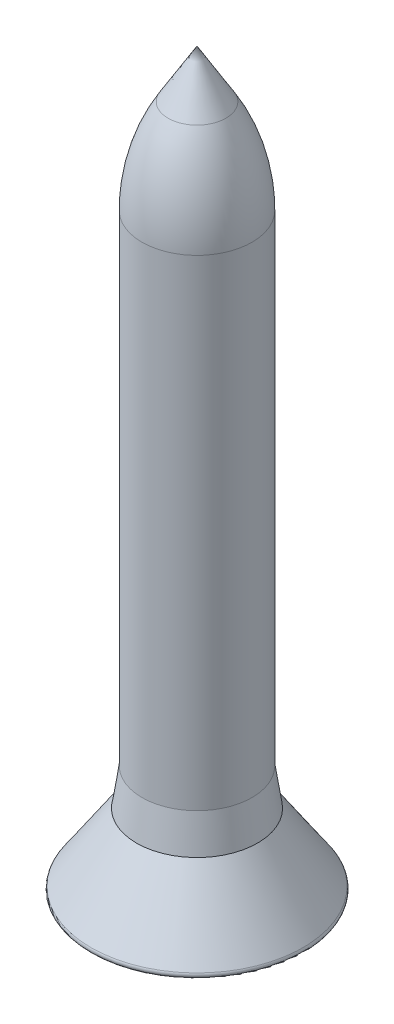
ISO-10303-21;
HEADER;
FILE_DESCRIPTION(('STEP AP214'),'2;1');
FILE_NAME('part.step','',(''),(''),'','','');
FILE_SCHEMA(('AUTOMOTIVE_DESIGN { 1 0 10303 214 1 1 1 1 }'));
ENDSEC;
DATA;
#1=APPLICATION_CONTEXT('core data for automotive mechanical design processes');
#2=APPLICATION_PROTOCOL_DEFINITION('international standard','automotive_design',2000,#1);
#3=PRODUCT_CONTEXT('',#1,'mechanical');
#4=PRODUCT('Part','Part','',(#3));
#5=PRODUCT_RELATED_PRODUCT_CATEGORY('part','',(#4));
#6=PRODUCT_DEFINITION_FORMATION('','',#4);
#7=PRODUCT_DEFINITION_CONTEXT('part definition',#1,'design');
#8=PRODUCT_DEFINITION('design','',#6,#7);
#9=PRODUCT_DEFINITION_SHAPE('','',#8);
#10=(LENGTH_UNIT() NAMED_UNIT(*) SI_UNIT(.MILLI.,.METRE.));
#11=(NAMED_UNIT(*) PLANE_ANGLE_UNIT() SI_UNIT($,.RADIAN.));
#12=(NAMED_UNIT(*) SI_UNIT($,.STERADIAN.) SOLID_ANGLE_UNIT());
#13=UNCERTAINTY_MEASURE_WITH_UNIT(LENGTH_MEASURE(1.E-05),#10,'distance_accuracy_value','');
#14=(GEOMETRIC_REPRESENTATION_CONTEXT(3) GLOBAL_UNCERTAINTY_ASSIGNED_CONTEXT((#13)) GLOBAL_UNIT_ASSIGNED_CONTEXT((#10,
#11,#12)) REPRESENTATION_CONTEXT('',''));
#15=CARTESIAN_POINT('',(0.,0.,0.));
#16=DIRECTION('',(0.,0.,1.));
#17=DIRECTION('',(1.,0.,0.));
#18=AXIS2_PLACEMENT_3D('',#15,#16,#17);
#19=CARTESIAN_POINT('',(0.,0.,0.));
#20=DIRECTION('',(0.,1.,0.));
#21=DIRECTION('',(0.,0.,1.));
#22=AXIS2_PLACEMENT_3D('',#19,#20,#21);
#23=PLANE('',#22);
#24=CARTESIAN_POINT('',(0.,0.,0.));
#25=DIRECTION('',(0.,1.,0.));
#26=DIRECTION('',(0.,0.,1.));
#27=AXIS2_PLACEMENT_3D('',#24,#25,#26);
#28=CIRCLE('',#27,2.81185071487986);
#29=CARTESIAN_POINT('',(0.,0.,2.81185071487986));
#30=VERTEX_POINT('',#29);
#31=EDGE_CURVE('E12',#30,#30,#28,.F.);
#32=ORIENTED_EDGE('',*,*,#31,.T.);
#33=EDGE_LOOP('',(#32));
#34=FACE_BOUND('',#33,.T.);
#35=DIRECTION('',(0.,0.,-1.));
#36=VECTOR('',#35,1.);
#37=CARTESIAN_POINT('',(1.8,0.,0.300000000000001));
#38=LINE('',#37,#36);
#39=CARTESIAN_POINT('',(1.8,0.,0.300000000000001));
#40=VERTEX_POINT('',#39);
#41=CARTESIAN_POINT('',(1.8,0.,-0.299999999999999));
#42=VERTEX_POINT('',#41);
#43=EDGE_CURVE('E151',#40,#42,#38,.T.);
#44=ORIENTED_EDGE('',*,*,#43,.T.);
#45=DIRECTION('',(1.,0.,0.));
#46=VECTOR('',#45,1.);
#47=CARTESIAN_POINT('',(-1.8,0.,-0.3));
#48=LINE('',#47,#46);
#49=CARTESIAN_POINT('',(0.3,0.,-0.3));
#50=VERTEX_POINT('',#49);
#51=EDGE_CURVE('E134',#50,#42,#48,.T.);
#52=ORIENTED_EDGE('',*,*,#51,.F.);
#53=DIRECTION('',(0.,0.,-1.));
#54=VECTOR('',#53,1.);
#55=CARTESIAN_POINT('',(0.299999999999999,0.,1.8));
#56=LINE('',#55,#54);
#57=CARTESIAN_POINT('',(0.3,0.,-1.8));
#58=VERTEX_POINT('',#57);
#59=EDGE_CURVE('E203',#50,#58,#56,.T.);
#60=ORIENTED_EDGE('',*,*,#59,.T.);
#61=DIRECTION('',(-1.,0.,0.));
#62=VECTOR('',#61,1.);
#63=CARTESIAN_POINT('',(0.3,0.,-1.8));
#64=LINE('',#63,#62);
#65=CARTESIAN_POINT('',(-0.3,0.,-1.8));
#66=VERTEX_POINT('',#65);
#67=EDGE_CURVE('E199',#58,#66,#64,.T.);
#68=ORIENTED_EDGE('',*,*,#67,.T.);
#69=DIRECTION('',(0.,0.,-1.));
#70=VECTOR('',#69,1.);
#71=CARTESIAN_POINT('',(-0.300000000000001,0.,1.8));
#72=LINE('',#71,#70);
#73=CARTESIAN_POINT('',(-0.3,0.,-0.299999999999999));
#74=VERTEX_POINT('',#73);
#75=EDGE_CURVE('E196',#74,#66,#72,.T.);
#76=ORIENTED_EDGE('',*,*,#75,.F.);
#77=CARTESIAN_POINT('',(-1.8,0.,-0.3));
#78=VERTEX_POINT('',#77);
#79=EDGE_CURVE('E145',#78,#74,#48,.T.);
#80=ORIENTED_EDGE('',*,*,#79,.F.);
#81=DIRECTION('',(0.,0.,1.));
#82=VECTOR('',#81,1.);
#83=CARTESIAN_POINT('',(-1.8,0.,-0.3));
#84=LINE('',#83,#82);
#85=CARTESIAN_POINT('',(-1.8,0.,0.3));
#86=VERTEX_POINT('',#85);
#87=EDGE_CURVE('E155',#78,#86,#84,.T.);
#88=ORIENTED_EDGE('',*,*,#87,.T.);
#89=DIRECTION('',(1.,0.,0.));
#90=VECTOR('',#89,1.);
#91=CARTESIAN_POINT('',(-1.8,0.,0.3));
#92=LINE('',#91,#90);
#93=CARTESIAN_POINT('',(-0.3,0.,0.3));
#94=VERTEX_POINT('',#93);
#95=EDGE_CURVE('E164',#86,#94,#92,.T.);
#96=ORIENTED_EDGE('',*,*,#95,.T.);
#97=CARTESIAN_POINT('',(-0.300000000000001,0.,1.8));
#98=VERTEX_POINT('',#97);
#99=EDGE_CURVE('E79',#98,#94,#72,.T.);
#100=ORIENTED_EDGE('',*,*,#99,.F.);
#101=DIRECTION('',(1.,0.,0.));
#102=VECTOR('',#101,1.);
#103=CARTESIAN_POINT('',(-0.300000000000001,0.,1.8));
#104=LINE('',#103,#102);
#105=CARTESIAN_POINT('',(0.299999999999999,0.,1.8));
#106=VERTEX_POINT('',#105);
#107=EDGE_CURVE('E207',#98,#106,#104,.T.);
#108=ORIENTED_EDGE('',*,*,#107,.T.);
#109=CARTESIAN_POINT('',(0.3,0.,0.3));
#110=VERTEX_POINT('',#109);
#111=EDGE_CURVE('E204',#106,#110,#56,.T.);
#112=ORIENTED_EDGE('',*,*,#111,.T.);
#113=EDGE_CURVE('E159',#110,#40,#92,.T.);
#114=ORIENTED_EDGE('',*,*,#113,.T.);
#115=EDGE_LOOP('',(#44,#52,#60,#68,#76,#80,#88,#96,#100,#108,#112,#114));
#116=FACE_BOUND('',#115,.T.);
#117=ADVANCED_FACE('F63',(#34,#116),#23,.F.);
#118=CARTESIAN_POINT('',(0.,0.,0.));
#119=DIRECTION('',(0.,-1.,0.));
#120=DIRECTION('',(0.,0.,-1.));
#121=AXIS2_PLACEMENT_3D('',#118,#119,#120);
#122=CONICAL_SURFACE('',#121,3.,0.593749666710771);
#123=CARTESIAN_POINT('',(0.,0.155947285500106,0.));
#124=DIRECTION('',(0.,1.,0.));
#125=DIRECTION('',(0.,0.,1.));
#126=AXIS2_PLACEMENT_3D('',#123,#124,#125);
#127=CIRCLE('',#126,2.89473558228743);
#128=CARTESIAN_POINT('',(0.,0.155947285500106,2.89473558228743));
#129=VERTEX_POINT('',#128);
#130=EDGE_CURVE('E72',#129,#129,#127,.T.);
#131=ORIENTED_EDGE('',*,*,#130,.T.);
#132=EDGE_LOOP('',(#131));
#133=FACE_BOUND('',#132,.T.);
#134=CARTESIAN_POINT('',(0.,2.,0.));
#135=DIRECTION('',(0.,1.,0.));
#136=DIRECTION('',(0.,0.,1.));
#137=AXIS2_PLACEMENT_3D('',#134,#135,#136);
#138=CIRCLE('',#137,1.65);
#139=CARTESIAN_POINT('',(0.,2.,1.65));
#140=VERTEX_POINT('',#139);
#141=EDGE_CURVE('E241',#140,#140,#138,.T.);
#142=ORIENTED_EDGE('',*,*,#141,.F.);
#143=EDGE_LOOP('',(#142));
#144=FACE_BOUND('',#143,.T.);
#145=ADVANCED_FACE('F248',(#133,#144),#122,.T.);
#146=CARTESIAN_POINT('',(0.,2.,0.));
#147=DIRECTION('',(0.,-1.,0.));
#148=DIRECTION('',(0.,0.,-1.));
#149=AXIS2_PLACEMENT_3D('',#146,#147,#148);
#150=CONICAL_SURFACE('',#149,1.65,0.148889947609497);
#151=CARTESIAN_POINT('',(0.,3.,0.));
#152=DIRECTION('',(0.,1.,0.));
#153=DIRECTION('',(0.,0.,1.));
#154=AXIS2_PLACEMENT_3D('',#151,#152,#153);
#155=CIRCLE('',#154,1.5);
#156=CARTESIAN_POINT('',(0.,3.,1.5));
#157=VERTEX_POINT('',#156);
#158=EDGE_CURVE('E237',#157,#157,#155,.T.);
#159=ORIENTED_EDGE('',*,*,#158,.F.);
#160=EDGE_LOOP('',(#159));
#161=FACE_BOUND('',#160,.T.);
#162=ORIENTED_EDGE('',*,*,#141,.T.);
#163=EDGE_LOOP('',(#162));
#164=FACE_BOUND('',#163,.T.);
#165=ADVANCED_FACE('F267',(#161,#164),#150,.T.);
#166=CARTESIAN_POINT('',(0.,0.,0.));
#167=DIRECTION('',(0.,1.,0.));
#168=DIRECTION('',(0.,0.,1.));
#169=AXIS2_PLACEMENT_3D('',#166,#167,#168);
#170=CYLINDRICAL_SURFACE('',#169,1.5);
#171=CARTESIAN_POINT('',(0.,16.1150801752578,0.));
#172=DIRECTION('',(0.,1.,0.));
#173=DIRECTION('',(0.,0.,1.));
#174=AXIS2_PLACEMENT_3D('',#171,#172,#173);
#175=CIRCLE('',#174,1.5);
#176=CARTESIAN_POINT('',(0.,16.1150801752578,1.5));
#177=VERTEX_POINT('',#176);
#178=EDGE_CURVE('E233',#177,#177,#175,.T.);
#179=ORIENTED_EDGE('',*,*,#178,.F.);
#180=EDGE_LOOP('',(#179));
#181=FACE_BOUND('',#180,.T.);
#182=ORIENTED_EDGE('',*,*,#158,.T.);
#183=EDGE_LOOP('',(#182));
#184=FACE_BOUND('',#183,.T.);
#185=ADVANCED_FACE('F272',(#181,#184),#170,.T.);
#186=CARTESIAN_POINT('',(0.,16.1150801752578,0.));
#187=DIRECTION('',(0.,1.,0.));
#188=DIRECTION('',(0.,0.,1.));
#189=AXIS2_PLACEMENT_3D('',#186,#187,#188);
#190=DEGENERATE_TOROIDAL_SURFACE('',#189,3.5,5.,.F.);
#191=CARTESIAN_POINT('',(0.,18.6875589523955,0.));
#192=DIRECTION('',(0.,1.,0.));
#193=DIRECTION('',(0.,0.,1.));
#194=AXIS2_PLACEMENT_3D('',#191,#192,#193);
#195=CIRCLE('',#194,0.787464628562719);
#196=CARTESIAN_POINT('',(0.,18.6875589523955,0.787464628562719));
#197=VERTEX_POINT('',#196);
#198=EDGE_CURVE('E229',#197,#197,#195,.T.);
#199=ORIENTED_EDGE('',*,*,#198,.F.);
#200=EDGE_LOOP('',(#199));
#201=FACE_BOUND('',#200,.T.);
#202=ORIENTED_EDGE('',*,*,#178,.T.);
#203=EDGE_LOOP('',(#202));
#204=FACE_BOUND('',#203,.T.);
#205=ADVANCED_FACE('F276',(#201,#204),#190,.F.);
#206=CARTESIAN_POINT('',(0.,18.6875589523955,0.));
#207=DIRECTION('',(0.,-1.,0.));
#208=DIRECTION('',(0.,0.,-1.));
#209=AXIS2_PLACEMENT_3D('',#206,#207,#208);
#210=CONICAL_SURFACE('',#209,0.787464628562719,0.540419500270586);
#211=CARTESIAN_POINT('',(0.,20.,0.));
#212=VERTEX_POINT('',#211);
#213=VERTEX_LOOP('',#212);
#214=FACE_BOUND('',#213,.T.);
#215=ORIENTED_EDGE('',*,*,#198,.T.);
#216=EDGE_LOOP('',(#215));
#217=FACE_BOUND('',#216,.T.);
#218=ADVANCED_FACE('F280',(#214,#217),#210,.T.);
#219=CARTESIAN_POINT('',(-0.300000000000001,0.,1.8));
#220=DIRECTION('',(-0.965925826289068,0.258819045102521,0.));
#221=DIRECTION('',(-0.258819045102521,-0.965925826289068,0.));
#222=AXIS2_PLACEMENT_3D('',#219,#220,#221);
#223=PLANE('',#222);
#224=DIRECTION('',(0.,0.,-1.));
#225=VECTOR('',#224,1.);
#226=CARTESIAN_POINT('',(0.,1.11961524227066,1.8));
#227=LINE('',#226,#225);
#228=CARTESIAN_POINT('',(0.,1.11961524227066,0.));
#229=VERTEX_POINT('',#228);
#230=CARTESIAN_POINT('',(0.,1.11961524227066,1.5));
#231=VERTEX_POINT('',#230);
#232=EDGE_CURVE('E215',#229,#231,#227,.F.);
#233=ORIENTED_EDGE('',*,*,#232,.T.);
#234=DIRECTION('',(0.250562807085732,0.935113126531029,-0.250562807085732));
#235=VECTOR('',#234,1.);
#236=CARTESIAN_POINT('',(-0.300000000000001,0.,1.8));
#237=LINE('',#236,#235);
#238=EDGE_CURVE('E212',#231,#98,#237,.F.);
#239=ORIENTED_EDGE('',*,*,#238,.T.);
#240=ORIENTED_EDGE('',*,*,#99,.T.);
#241=DIRECTION('',(0.250562807085732,0.935113126531029,-0.250562807085732));
#242=VECTOR('',#241,1.);
#243=CARTESIAN_POINT('',(-0.394172580442023,-0.351456854889495,0.394172580442023));
#244=LINE('',#243,#242);
#245=EDGE_CURVE('E187',#229,#94,#244,.F.);
#246=ORIENTED_EDGE('',*,*,#245,.F.);
#247=EDGE_LOOP('',(#233,#239,#240,#246));
#248=FACE_BOUND('',#247,.T.);
#249=ADVANCED_FACE('F284',(#248),#223,.F.);
#250=CARTESIAN_POINT('',(0.299999999999999,0.,1.8));
#251=DIRECTION('',(0.965925826289068,0.258819045102521,0.));
#252=DIRECTION('',(-0.258819045102521,0.965925826289068,0.));
#253=AXIS2_PLACEMENT_3D('',#250,#251,#252);
#254=PLANE('',#253);
#255=DIRECTION('',(0.250562807085732,-0.935113126531029,0.250562807085732));
#256=VECTOR('',#255,1.);
#257=CARTESIAN_POINT('',(0.394172580442022,-0.351456854889495,0.394172580442023));
#258=LINE('',#257,#256);
#259=EDGE_CURVE('E184',#229,#110,#258,.T.);
#260=ORIENTED_EDGE('',*,*,#259,.T.);
#261=ORIENTED_EDGE('',*,*,#111,.F.);
#262=DIRECTION('',(0.250562807085732,-0.935113126531029,0.250562807085732));
#263=VECTOR('',#262,1.);
#264=CARTESIAN_POINT('',(0.299999999999999,0.,1.8));
#265=LINE('',#264,#263);
#266=EDGE_CURVE('E216',#231,#106,#265,.T.);
#267=ORIENTED_EDGE('',*,*,#266,.F.);
#268=ORIENTED_EDGE('',*,*,#232,.F.);
#269=EDGE_LOOP('',(#260,#261,#267,#268));
#270=FACE_BOUND('',#269,.T.);
#271=ADVANCED_FACE('F295',(#270),#254,.F.);
#272=DIRECTION('',(-0.250562807085732,-0.935113126531029,-0.250562807085732));
#273=VECTOR('',#272,1.);
#274=CARTESIAN_POINT('',(-0.168158387381168,0.492039596845293,-0.168158387381167));
#275=LINE('',#274,#273);
#276=EDGE_CURVE('E192',#229,#74,#275,.T.);
#277=ORIENTED_EDGE('',*,*,#276,.T.);
#278=ORIENTED_EDGE('',*,*,#75,.T.);
#279=DIRECTION('',(0.250562807085732,0.935113126531029,0.250562807085732));
#280=VECTOR('',#279,1.);
#281=CARTESIAN_POINT('',(-0.262330967823191,0.140582741955798,-1.76233096782319));
#282=LINE('',#281,#280);
#283=CARTESIAN_POINT('',(0.,1.11961524227066,-1.5));
#284=VERTEX_POINT('',#283);
#285=EDGE_CURVE('E211',#284,#66,#282,.F.);
#286=ORIENTED_EDGE('',*,*,#285,.F.);
#287=EDGE_CURVE('E225',#284,#229,#227,.F.);
#288=ORIENTED_EDGE('',*,*,#287,.T.);
#289=EDGE_LOOP('',(#277,#278,#286,#288));
#290=FACE_BOUND('',#289,.T.);
#291=ADVANCED_FACE('F289',(#290),#223,.F.);
#292=CARTESIAN_POINT('',(-0.300000000000001,0.,1.8));
#293=DIRECTION('',(0.,0.258819045102521,0.965925826289068));
#294=DIRECTION('',(0.,-0.965925826289068,0.258819045102521));
#295=AXIS2_PLACEMENT_3D('',#292,#293,#294);
#296=PLANE('',#295);
#297=ORIENTED_EDGE('',*,*,#107,.F.);
#298=ORIENTED_EDGE('',*,*,#238,.F.);
#299=ORIENTED_EDGE('',*,*,#266,.T.);
#300=EDGE_LOOP('',(#297,#298,#299));
#301=FACE_BOUND('',#300,.T.);
#302=ADVANCED_FACE('F285',(#301),#296,.F.);
#303=ORIENTED_EDGE('',*,*,#287,.F.);
#304=DIRECTION('',(0.250562807085732,-0.935113126531029,-0.250562807085732));
#305=VECTOR('',#304,1.);
#306=CARTESIAN_POINT('',(0.3,0.,-1.8));
#307=LINE('',#306,#305);
#308=EDGE_CURVE('E220',#284,#58,#307,.T.);
#309=ORIENTED_EDGE('',*,*,#308,.T.);
#310=ORIENTED_EDGE('',*,*,#59,.F.);
#311=DIRECTION('',(-0.250562807085732,0.935113126531029,0.250562807085732));
#312=VECTOR('',#311,1.);
#313=CARTESIAN_POINT('',(0.168158387381168,0.492039596845293,-0.168158387381168));
#314=LINE('',#313,#312);
#315=EDGE_CURVE('E140',#229,#50,#314,.F.);
#316=ORIENTED_EDGE('',*,*,#315,.F.);
#317=EDGE_LOOP('',(#303,#309,#310,#316));
#318=FACE_BOUND('',#317,.T.);
#319=ADVANCED_FACE('F288',(#318),#254,.F.);
#320=CARTESIAN_POINT('',(0.3,0.,-1.8));
#321=DIRECTION('',(0.,0.258819045102521,-0.965925826289068));
#322=DIRECTION('',(0.,0.965925826289068,0.258819045102521));
#323=AXIS2_PLACEMENT_3D('',#320,#321,#322);
#324=PLANE('',#323);
#325=ORIENTED_EDGE('',*,*,#67,.F.);
#326=ORIENTED_EDGE('',*,*,#308,.F.);
#327=ORIENTED_EDGE('',*,*,#285,.T.);
#328=EDGE_LOOP('',(#325,#326,#327));
#329=FACE_BOUND('',#328,.T.);
#330=ADVANCED_FACE('F293',(#329),#324,.F.);
#331=CARTESIAN_POINT('',(1.8,0.,0.300000000000001));
#332=DIRECTION('',(0.965925826289068,0.258819045102521,0.));
#333=DIRECTION('',(-0.258819045102521,0.965925826289068,0.));
#334=AXIS2_PLACEMENT_3D('',#331,#332,#333);
#335=PLANE('',#334);
#336=ORIENTED_EDGE('',*,*,#43,.F.);
#337=DIRECTION('',(0.250562807085732,-0.935113126531029,0.250562807085732));
#338=VECTOR('',#337,1.);
#339=CARTESIAN_POINT('',(1.8,0.,0.300000000000001));
#340=LINE('',#339,#338);
#341=CARTESIAN_POINT('',(1.5,1.11961524227066,0.));
#342=VERTEX_POINT('',#341);
#343=EDGE_CURVE('E153',#342,#40,#340,.T.);
#344=ORIENTED_EDGE('',*,*,#343,.F.);
#345=DIRECTION('',(-0.250562807085732,0.935113126531029,0.250562807085732));
#346=VECTOR('',#345,1.);
#347=CARTESIAN_POINT('',(1.76233096782319,0.140582741955798,-0.26233096782319));
#348=LINE('',#347,#346);
#349=EDGE_CURVE('E138',#342,#42,#348,.F.);
#350=ORIENTED_EDGE('',*,*,#349,.T.);
#351=EDGE_LOOP('',(#336,#344,#350));
#352=FACE_BOUND('',#351,.T.);
#353=ADVANCED_FACE('F150',(#352),#335,.F.);
#354=CARTESIAN_POINT('',(-1.8,0.,0.3));
#355=DIRECTION('',(0.,0.258819045102521,0.965925826289068));
#356=DIRECTION('',(0.,-0.965925826289068,0.258819045102521));
#357=AXIS2_PLACEMENT_3D('',#354,#355,#356);
#358=PLANE('',#357);
#359=DIRECTION('',(1.,0.,0.));
#360=VECTOR('',#359,1.);
#361=CARTESIAN_POINT('',(-1.8,1.11961524227066,0.));
#362=LINE('',#361,#360);
#363=EDGE_CURVE('E181',#342,#229,#362,.F.);
#364=ORIENTED_EDGE('',*,*,#363,.F.);
#365=ORIENTED_EDGE('',*,*,#343,.T.);
#366=ORIENTED_EDGE('',*,*,#113,.F.);
#367=ORIENTED_EDGE('',*,*,#259,.F.);
#368=EDGE_LOOP('',(#364,#365,#366,#367));
#369=FACE_BOUND('',#368,.T.);
#370=ADVANCED_FACE('F260',(#369),#358,.F.);
#371=CARTESIAN_POINT('',(-1.8,0.,-0.3));
#372=DIRECTION('',(0.,0.258819045102521,-0.965925826289068));
#373=DIRECTION('',(0.,0.965925826289068,0.258819045102521));
#374=AXIS2_PLACEMENT_3D('',#371,#372,#373);
#375=PLANE('',#374);
#376=ORIENTED_EDGE('',*,*,#315,.T.);
#377=ORIENTED_EDGE('',*,*,#51,.T.);
#378=ORIENTED_EDGE('',*,*,#349,.F.);
#379=ORIENTED_EDGE('',*,*,#363,.T.);
#380=EDGE_LOOP('',(#376,#377,#378,#379));
#381=FACE_BOUND('',#380,.T.);
#382=ADVANCED_FACE('F136',(#381),#375,.F.);
#383=CARTESIAN_POINT('',(-1.5,1.11961524227066,0.));
#384=VERTEX_POINT('',#383);
#385=EDGE_CURVE('E174',#229,#384,#362,.F.);
#386=ORIENTED_EDGE('',*,*,#385,.T.);
#387=DIRECTION('',(0.250562807085732,0.935113126531029,0.250562807085732));
#388=VECTOR('',#387,1.);
#389=CARTESIAN_POINT('',(-1.8,0.,-0.3));
#390=LINE('',#389,#388);
#391=EDGE_CURVE('E172',#384,#78,#390,.F.);
#392=ORIENTED_EDGE('',*,*,#391,.T.);
#393=ORIENTED_EDGE('',*,*,#79,.T.);
#394=ORIENTED_EDGE('',*,*,#276,.F.);
#395=EDGE_LOOP('',(#386,#392,#393,#394));
#396=FACE_BOUND('',#395,.T.);
#397=ADVANCED_FACE('F303',(#396),#375,.F.);
#398=CARTESIAN_POINT('',(-1.8,0.,-0.3));
#399=DIRECTION('',(-0.965925826289068,0.258819045102521,0.));
#400=DIRECTION('',(-0.258819045102521,-0.965925826289068,0.));
#401=AXIS2_PLACEMENT_3D('',#398,#399,#400);
#402=PLANE('',#401);
#403=ORIENTED_EDGE('',*,*,#87,.F.);
#404=ORIENTED_EDGE('',*,*,#391,.F.);
#405=DIRECTION('',(-0.250562807085732,-0.935113126531029,0.250562807085732));
#406=VECTOR('',#405,1.);
#407=CARTESIAN_POINT('',(-1.8,0.,0.3));
#408=LINE('',#407,#406);
#409=EDGE_CURVE('E175',#384,#86,#408,.T.);
#410=ORIENTED_EDGE('',*,*,#409,.T.);
#411=EDGE_LOOP('',(#403,#404,#410));
#412=FACE_BOUND('',#411,.T.);
#413=ADVANCED_FACE('F257',(#412),#402,.F.);
#414=ORIENTED_EDGE('',*,*,#245,.T.);
#415=ORIENTED_EDGE('',*,*,#95,.F.);
#416=ORIENTED_EDGE('',*,*,#409,.F.);
#417=ORIENTED_EDGE('',*,*,#385,.F.);
#418=EDGE_LOOP('',(#414,#415,#416,#417));
#419=FACE_BOUND('',#418,.T.);
#420=ADVANCED_FACE('F252',(#419),#358,.F.);
#421=CARTESIAN_POINT('',(0.,0.1,0.));
#422=DIRECTION('',(0.,1.,0.));
#423=DIRECTION('',(0.,0.,1.));
#424=AXIS2_PLACEMENT_3D('',#421,#422,#423);
#425=TOROIDAL_SURFACE('',#424,2.81185071487986,0.1);
#426=ORIENTED_EDGE('',*,*,#31,.F.);
#427=EDGE_LOOP('',(#426));
#428=FACE_BOUND('',#427,.T.);
#429=ORIENTED_EDGE('',*,*,#130,.F.);
#430=EDGE_LOOP('',(#429));
#431=FACE_BOUND('',#430,.T.);
#432=ADVANCED_FACE('F65',(#428,#431),#425,.T.);
#433=CLOSED_SHELL('',(#117,#145,#165,#185,#205,#218,#249,#271,#291,#302,#319,#330,#353,#370,
#382,#397,#413,#420,#432));
#434=MANIFOLD_SOLID_BREP('B2',#433);
#435=ADVANCED_BREP_SHAPE_REPRESENTATION('',(#18,#434),#14);
#436=SHAPE_DEFINITION_REPRESENTATION(#9,#435);
ENDSEC;
END-ISO-10303-21;
